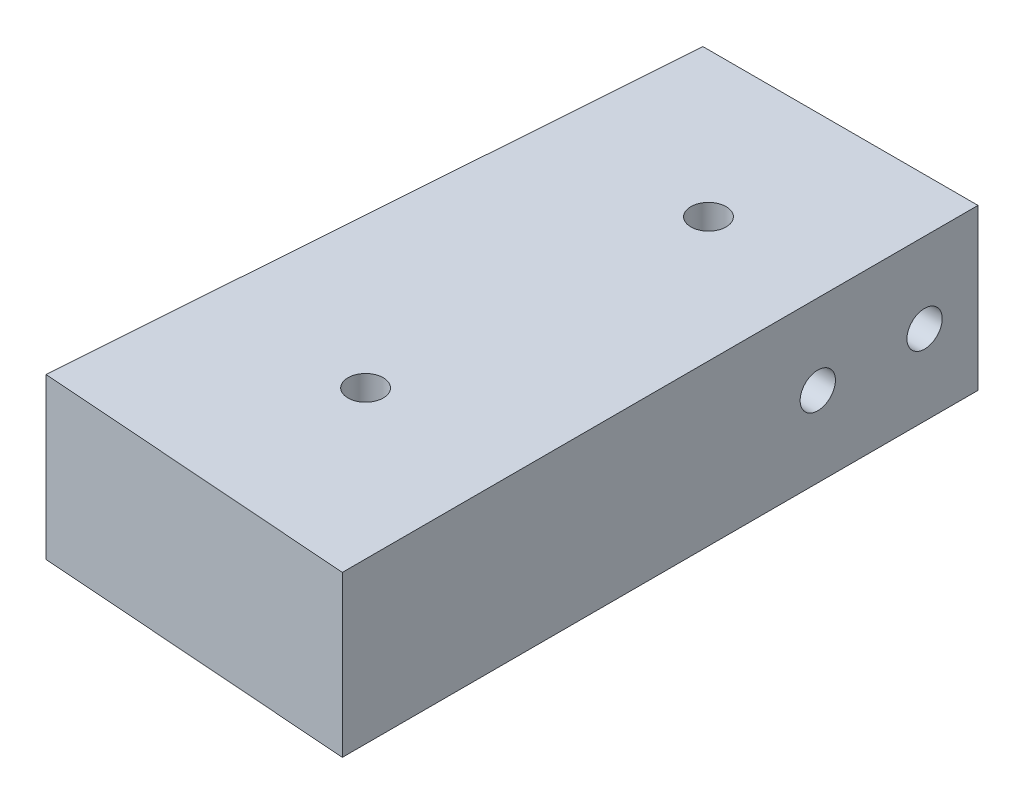
ISO-10303-21;
HEADER;
FILE_DESCRIPTION(('STEP AP214'),'2;1');
FILE_NAME('part.step','',(''),(''),'','','');
FILE_SCHEMA(('AUTOMOTIVE_DESIGN { 1 0 10303 214 1 1 1 1 }'));
ENDSEC;
DATA;
#1=APPLICATION_CONTEXT('core data for automotive mechanical design processes');
#2=APPLICATION_PROTOCOL_DEFINITION('international standard','automotive_design',2000,#1);
#3=PRODUCT_CONTEXT('',#1,'mechanical');
#4=PRODUCT('Part','Part','',(#3));
#5=PRODUCT_RELATED_PRODUCT_CATEGORY('part','',(#4));
#6=PRODUCT_DEFINITION_FORMATION('','',#4);
#7=PRODUCT_DEFINITION_CONTEXT('part definition',#1,'design');
#8=PRODUCT_DEFINITION('design','',#6,#7);
#9=PRODUCT_DEFINITION_SHAPE('','',#8);
#10=(LENGTH_UNIT() NAMED_UNIT(*) SI_UNIT(.MILLI.,.METRE.));
#11=(NAMED_UNIT(*) PLANE_ANGLE_UNIT() SI_UNIT($,.RADIAN.));
#12=(NAMED_UNIT(*) SI_UNIT($,.STERADIAN.) SOLID_ANGLE_UNIT());
#13=UNCERTAINTY_MEASURE_WITH_UNIT(LENGTH_MEASURE(1.E-05),#10,'distance_accuracy_value','');
#14=(GEOMETRIC_REPRESENTATION_CONTEXT(3) GLOBAL_UNCERTAINTY_ASSIGNED_CONTEXT((#13)) GLOBAL_UNIT_ASSIGNED_CONTEXT((#10,
#11,#12)) REPRESENTATION_CONTEXT('',''));
#15=CARTESIAN_POINT('',(0.,0.,0.));
#16=DIRECTION('',(0.,0.,1.));
#17=DIRECTION('',(1.,0.,0.));
#18=AXIS2_PLACEMENT_3D('',#15,#16,#17);
#19=CARTESIAN_POINT('',(680.,15.,0.));
#20=DIRECTION('',(0.,0.,1.));
#21=DIRECTION('',(1.,0.,0.));
#22=AXIS2_PLACEMENT_3D('',#19,#20,#21);
#23=PLANE('',#22);
#24=DIRECTION('',(-1.,0.,0.));
#25=VECTOR('',#24,1.);
#26=CARTESIAN_POINT('',(680.,0.,0.));
#27=LINE('',#26,#25);
#28=CARTESIAN_POINT('',(680.,0.,0.));
#29=VERTEX_POINT('',#28);
#30=CARTESIAN_POINT('',(654.253441161619,0.,0.));
#31=VERTEX_POINT('',#30);
#32=EDGE_CURVE('E111',#29,#31,#27,.T.);
#33=ORIENTED_EDGE('',*,*,#32,.T.);
#34=DIRECTION('',(0.,-1.,0.));
#35=VECTOR('',#34,1.);
#36=CARTESIAN_POINT('',(654.253441161619,15.,0.));
#37=LINE('',#36,#35);
#38=CARTESIAN_POINT('',(654.253441161619,15.,0.));
#39=VERTEX_POINT('',#38);
#40=EDGE_CURVE('E11',#39,#31,#37,.T.);
#41=ORIENTED_EDGE('',*,*,#40,.F.);
#42=DIRECTION('',(-1.,0.,0.));
#43=VECTOR('',#42,1.);
#44=CARTESIAN_POINT('',(680.,15.,0.));
#45=LINE('',#44,#43);
#46=CARTESIAN_POINT('',(680.,15.,0.));
#47=VERTEX_POINT('',#46);
#48=EDGE_CURVE('E98',#47,#39,#45,.T.);
#49=ORIENTED_EDGE('',*,*,#48,.F.);
#50=DIRECTION('',(0.,-1.,0.));
#51=VECTOR('',#50,1.);
#52=CARTESIAN_POINT('',(680.,15.,0.));
#53=LINE('',#52,#51);
#54=EDGE_CURVE('E107',#47,#29,#53,.T.);
#55=ORIENTED_EDGE('',*,*,#54,.T.);
#56=EDGE_LOOP('',(#33,#41,#49,#55));
#57=FACE_BOUND('',#56,.T.);
#58=ADVANCED_FACE('F41',(#57),#23,.F.);
#59=CARTESIAN_POINT('',(654.253441161619,15.,0.));
#60=DIRECTION('',(0.997359929598123,0.,0.0726166016281953));
#61=DIRECTION('',(0.0726166016281953,0.,-0.997359929598123));
#62=AXIS2_PLACEMENT_3D('',#59,#60,#61);
#63=PLANE('',#62);
#64=CARTESIAN_POINT('',(653.161308830955,7.50000000000047,15.));
#65=DIRECTION('',(0.997359929598123,0.,0.0726166016281953));
#66=DIRECTION('',(0.0726166016281953,0.,-0.997359929598123));
#67=AXIS2_PLACEMENT_3D('',#64,#65,#66);
#68=ELLIPSE('',#67,1.65436764705882,1.65);
#69=CARTESIAN_POINT('',(653.281443387328,7.50000000000047,13.35));
#70=VERTEX_POINT('',#69);
#71=EDGE_CURVE('E139',#70,#70,#68,.T.);
#72=ORIENTED_EDGE('',*,*,#71,.T.);
#73=EDGE_LOOP('',(#72));
#74=FACE_BOUND('',#73,.T.);
#75=CARTESIAN_POINT('',(653.889397051398,7.50000000000047,5.));
#76=DIRECTION('',(0.997359929598123,0.,0.0726166016281953));
#77=DIRECTION('',(0.0726166016281953,0.,-0.997359929598123));
#78=AXIS2_PLACEMENT_3D('',#75,#76,#77);
#79=ELLIPSE('',#78,1.65436764705882,1.65);
#80=CARTESIAN_POINT('',(654.009531607771,7.50000000000047,3.35));
#81=VERTEX_POINT('',#80);
#82=EDGE_CURVE('E129',#81,#81,#79,.T.);
#83=ORIENTED_EDGE('',*,*,#82,.T.);
#84=EDGE_LOOP('',(#83));
#85=FACE_BOUND('',#84,.T.);
#86=DIRECTION('',(-0.0726166016281953,0.,0.997359929598123));
#87=VECTOR('',#86,1.);
#88=CARTESIAN_POINT('',(654.253441161619,0.,0.));
#89=LINE('',#88,#87);
#90=CARTESIAN_POINT('',(650.079202112056,0.,57.3315009412578));
#91=VERTEX_POINT('',#90);
#92=EDGE_CURVE('E102',#31,#91,#89,.T.);
#93=ORIENTED_EDGE('',*,*,#92,.T.);
#94=DIRECTION('',(0.,-1.,0.));
#95=VECTOR('',#94,1.);
#96=CARTESIAN_POINT('',(650.079202112056,15.,57.3315009412578));
#97=LINE('',#96,#95);
#98=CARTESIAN_POINT('',(650.079202112056,15.,57.3315009412578));
#99=VERTEX_POINT('',#98);
#100=EDGE_CURVE('E55',#99,#91,#97,.T.);
#101=ORIENTED_EDGE('',*,*,#100,.F.);
#102=DIRECTION('',(-0.0726166016281953,0.,0.997359929598123));
#103=VECTOR('',#102,1.);
#104=CARTESIAN_POINT('',(654.253441161619,15.,0.));
#105=LINE('',#104,#103);
#106=EDGE_CURVE('E93',#39,#99,#105,.T.);
#107=ORIENTED_EDGE('',*,*,#106,.F.);
#108=ORIENTED_EDGE('',*,*,#40,.T.);
#109=EDGE_LOOP('',(#93,#101,#107,#108));
#110=FACE_BOUND('',#109,.T.);
#111=ADVANCED_FACE('F101',(#74,#85,#110),#63,.F.);
#112=CARTESIAN_POINT('',(650.079202112056,15.,57.3315009412578));
#113=DIRECTION('',(0.0726166016281349,0.,-0.997359929598127));
#114=DIRECTION('',(-0.997359929598127,0.,-0.0726166016281349));
#115=AXIS2_PLACEMENT_3D('',#112,#113,#114);
#116=PLANE('',#115);
#117=DIRECTION('',(0.997359929598127,0.,0.0726166016281349));
#118=VECTOR('',#117,1.);
#119=CARTESIAN_POINT('',(650.079202112056,0.,57.3315009412578));
#120=LINE('',#119,#118);
#121=CARTESIAN_POINT('',(680.,0.,59.5099989901018));
#122=VERTEX_POINT('',#121);
#123=EDGE_CURVE('E80',#91,#122,#120,.T.);
#124=ORIENTED_EDGE('',*,*,#123,.T.);
#125=DIRECTION('',(0.,-1.,0.));
#126=VECTOR('',#125,1.);
#127=CARTESIAN_POINT('',(680.,15.,59.5099989901018));
#128=LINE('',#127,#126);
#129=CARTESIAN_POINT('',(680.,15.,59.5099989901018));
#130=VERTEX_POINT('',#129);
#131=EDGE_CURVE('E103',#130,#122,#128,.T.);
#132=ORIENTED_EDGE('',*,*,#131,.F.);
#133=DIRECTION('',(0.997359929598127,0.,0.0726166016281349));
#134=VECTOR('',#133,1.);
#135=CARTESIAN_POINT('',(650.079202112056,15.,57.3315009412578));
#136=LINE('',#135,#134);
#137=EDGE_CURVE('E96',#99,#130,#136,.T.);
#138=ORIENTED_EDGE('',*,*,#137,.F.);
#139=ORIENTED_EDGE('',*,*,#100,.T.);
#140=EDGE_LOOP('',(#124,#132,#138,#139));
#141=FACE_BOUND('',#140,.T.);
#142=ADVANCED_FACE('F105',(#141),#116,.F.);
#143=CARTESIAN_POINT('',(680.,15.,59.5099989901018));
#144=DIRECTION('',(-1.,0.,0.));
#145=DIRECTION('',(0.,0.,1.));
#146=AXIS2_PLACEMENT_3D('',#143,#144,#145);
#147=PLANE('',#146);
#148=CARTESIAN_POINT('',(680.,7.50000000000047,15.));
#149=DIRECTION('',(1.,0.,0.));
#150=DIRECTION('',(0.,0.,-1.));
#151=AXIS2_PLACEMENT_3D('',#148,#149,#150);
#152=CIRCLE('',#151,1.65);
#153=CARTESIAN_POINT('',(680.,7.50000000000047,13.35));
#154=VERTEX_POINT('',#153);
#155=EDGE_CURVE('E145',#154,#154,#152,.T.);
#156=ORIENTED_EDGE('',*,*,#155,.F.);
#157=EDGE_LOOP('',(#156));
#158=FACE_BOUND('',#157,.T.);
#159=CARTESIAN_POINT('',(680.,7.50000000000047,5.));
#160=DIRECTION('',(1.,0.,0.));
#161=DIRECTION('',(0.,0.,-1.));
#162=AXIS2_PLACEMENT_3D('',#159,#160,#161);
#163=CIRCLE('',#162,1.65);
#164=CARTESIAN_POINT('',(680.,7.50000000000047,3.35));
#165=VERTEX_POINT('',#164);
#166=EDGE_CURVE('E142',#165,#165,#163,.T.);
#167=ORIENTED_EDGE('',*,*,#166,.F.);
#168=EDGE_LOOP('',(#167));
#169=FACE_BOUND('',#168,.T.);
#170=DIRECTION('',(0.,0.,-1.));
#171=VECTOR('',#170,1.);
#172=CARTESIAN_POINT('',(680.,0.,59.5099989901018));
#173=LINE('',#172,#171);
#174=EDGE_CURVE('E86',#122,#29,#173,.T.);
#175=ORIENTED_EDGE('',*,*,#174,.T.);
#176=ORIENTED_EDGE('',*,*,#54,.F.);
#177=DIRECTION('',(0.,0.,-1.));
#178=VECTOR('',#177,1.);
#179=CARTESIAN_POINT('',(680.,15.,59.5099989901018));
#180=LINE('',#179,#178);
#181=EDGE_CURVE('E63',#130,#47,#180,.T.);
#182=ORIENTED_EDGE('',*,*,#181,.F.);
#183=ORIENTED_EDGE('',*,*,#131,.T.);
#184=EDGE_LOOP('',(#175,#176,#182,#183));
#185=FACE_BOUND('',#184,.T.);
#186=ADVANCED_FACE('F119',(#158,#169,#185),#147,.F.);
#187=CARTESIAN_POINT('',(0.,15.,0.));
#188=DIRECTION('',(0.,-1.,0.));
#189=DIRECTION('',(0.,0.,-1.));
#190=AXIS2_PLACEMENT_3D('',#187,#188,#189);
#191=PLANE('',#190);
#192=CARTESIAN_POINT('',(668.307348129297,15.,13.5395531337617));
#193=DIRECTION('',(0.,1.,0.));
#194=DIRECTION('',(0.,0.,1.));
#195=AXIS2_PLACEMENT_3D('',#192,#193,#194);
#196=CIRCLE('',#195,1.65000000000005);
#197=CARTESIAN_POINT('',(668.307348129297,15.,15.1895531337618));
#198=VERTEX_POINT('',#197);
#199=EDGE_CURVE('E132',#198,#198,#196,.T.);
#200=ORIENTED_EDGE('',*,*,#199,.F.);
#201=EDGE_LOOP('',(#200));
#202=FACE_BOUND('',#201,.T.);
#203=CARTESIAN_POINT('',(666.128850080451,15.,43.4603510217054));
#204=DIRECTION('',(0.,1.,0.));
#205=DIRECTION('',(0.,0.,1.));
#206=AXIS2_PLACEMENT_3D('',#203,#204,#205);
#207=CIRCLE('',#206,1.65000000000005);
#208=CARTESIAN_POINT('',(666.128850080451,15.,45.1103510217055));
#209=VERTEX_POINT('',#208);
#210=EDGE_CURVE('E128',#209,#209,#207,.T.);
#211=ORIENTED_EDGE('',*,*,#210,.F.);
#212=EDGE_LOOP('',(#211));
#213=FACE_BOUND('',#212,.T.);
#214=ORIENTED_EDGE('',*,*,#48,.T.);
#215=ORIENTED_EDGE('',*,*,#106,.T.);
#216=ORIENTED_EDGE('',*,*,#137,.T.);
#217=ORIENTED_EDGE('',*,*,#181,.T.);
#218=EDGE_LOOP('',(#214,#215,#216,#217));
#219=FACE_BOUND('',#218,.T.);
#220=ADVANCED_FACE('F94',(#202,#213,#219),#191,.F.);
#221=CARTESIAN_POINT('',(0.,0.,0.));
#222=DIRECTION('',(0.,-1.,0.));
#223=DIRECTION('',(0.,0.,-1.));
#224=AXIS2_PLACEMENT_3D('',#221,#222,#223);
#225=PLANE('',#224);
#226=CARTESIAN_POINT('',(668.307348129297,0.,13.5395531337617));
#227=DIRECTION('',(0.,1.,0.));
#228=DIRECTION('',(0.,0.,1.));
#229=AXIS2_PLACEMENT_3D('',#226,#227,#228);
#230=CIRCLE('',#229,1.65000000000005);
#231=CARTESIAN_POINT('',(668.307348129297,0.,15.1895531337618));
#232=VERTEX_POINT('',#231);
#233=EDGE_CURVE('E114',#232,#232,#230,.T.);
#234=ORIENTED_EDGE('',*,*,#233,.T.);
#235=EDGE_LOOP('',(#234));
#236=FACE_BOUND('',#235,.T.);
#237=CARTESIAN_POINT('',(666.128850080451,0.,43.4603510217054));
#238=DIRECTION('',(0.,1.,0.));
#239=DIRECTION('',(0.,0.,1.));
#240=AXIS2_PLACEMENT_3D('',#237,#238,#239);
#241=CIRCLE('',#240,1.65000000000005);
#242=CARTESIAN_POINT('',(666.128850080451,0.,45.1103510217055));
#243=VERTEX_POINT('',#242);
#244=EDGE_CURVE('E125',#243,#243,#241,.T.);
#245=ORIENTED_EDGE('',*,*,#244,.T.);
#246=EDGE_LOOP('',(#245));
#247=FACE_BOUND('',#246,.T.);
#248=ORIENTED_EDGE('',*,*,#32,.F.);
#249=ORIENTED_EDGE('',*,*,#174,.F.);
#250=ORIENTED_EDGE('',*,*,#123,.F.);
#251=ORIENTED_EDGE('',*,*,#92,.F.);
#252=EDGE_LOOP('',(#248,#249,#250,#251));
#253=FACE_BOUND('',#252,.T.);
#254=ADVANCED_FACE('F122',(#236,#247,#253),#225,.T.);
#255=CARTESIAN_POINT('',(668.307348129297,0.,13.5395531337617));
#256=DIRECTION('',(0.,1.,0.));
#257=DIRECTION('',(0.,0.,1.));
#258=AXIS2_PLACEMENT_3D('',#255,#256,#257);
#259=CYLINDRICAL_SURFACE('',#258,1.65000000000005);
#260=CARTESIAN_POINT('',(668.307348129297,5.8609241599366,15.1895531337618));
#261=CARTESIAN_POINT('',(668.399747226542,5.86091764661438,15.1895492101784));
#262=CARTESIAN_POINT('',(668.492276754375,5.85996489547775,15.1817580800193));
#263=CARTESIAN_POINT('',(668.674853657749,5.85683261649108,15.1507797050328));
#264=CARTESIAN_POINT('',(668.764894453461,5.85465011244027,15.1275550841114));
#265=CARTESIAN_POINT('',(668.939809624515,5.85105082015213,15.0663357607546));
#266=CARTESIAN_POINT('',(669.024686185256,5.84963370598925,15.0283473570417));
#267=CARTESIAN_POINT('',(669.186838371618,5.85053093587943,14.9386888582936));
#268=CARTESIAN_POINT('',(669.264117256017,5.85284367265922,14.8870246644697));
#269=CARTESIAN_POINT('',(669.407009432613,5.86471601021422,14.7729923043127));
#270=CARTESIAN_POINT('',(669.472849378032,5.87410841151776,14.7108964116558));
#271=CARTESIAN_POINT('',(669.562530992107,5.89603514030355,14.6114777934852));
#272=CARTESIAN_POINT('',(669.590907936487,5.90464836714072,14.5772985246042));
#273=CARTESIAN_POINT('',(669.644443940042,5.92484450901759,14.5073411215113));
#274=CARTESIAN_POINT('',(669.669603652798,5.936426819446,14.4715633140422));
#275=CARTESIAN_POINT('',(669.733433807648,5.97241799353401,14.3727915506338));
#276=CARTESIAN_POINT('',(669.768782333327,6.00005654433805,14.3087565079686));
#277=CARTESIAN_POINT('',(669.829122295231,6.06570830557103,14.1811891603601));
#278=CARTESIAN_POINT('',(669.854115925868,6.10371931503109,14.1176567517006));
#279=CARTESIAN_POINT('',(669.892945714185,6.185868046245,13.999870148957));
#280=CARTESIAN_POINT('',(669.907567269903,6.22917776059027,13.9452906607304));
#281=CARTESIAN_POINT('',(669.930380709386,6.32313428733789,13.8413806940099));
#282=CARTESIAN_POINT('',(669.938570754621,6.37378319284728,13.7920517199259));
#283=CARTESIAN_POINT('',(669.950659340416,6.48579034402281,13.6962537166267));
#284=CARTESIAN_POINT('',(669.954142355624,6.5476897152337,13.6503675869106));
#285=CARTESIAN_POINT('',(669.957629629536,6.67735118495797,13.5676330949683));
#286=CARTESIAN_POINT('',(669.957631787711,6.74511679880081,13.530790203304));
#287=CARTESIAN_POINT('',(669.955948648797,6.89508242743135,13.4623742402532));
#288=CARTESIAN_POINT('',(669.95402339019,6.97796484602692,13.432295174597));
#289=CARTESIAN_POINT('',(669.950326892514,7.14746273215178,13.3857049698347));
#290=CARTESIAN_POINT('',(669.948555680266,7.2340788458524,13.36919618927));
#291=CARTESIAN_POINT('',(669.946417791439,7.41364895665387,13.3496566522874));
#292=CARTESIAN_POINT('',(669.946133072009,7.50669080671574,13.3474109083517));
#293=CARTESIAN_POINT('',(669.947400487159,7.69182371951429,13.3585654147575));
#294=CARTESIAN_POINT('',(669.948952890916,7.78391464092532,13.3719679579001));
#295=CARTESIAN_POINT('',(669.952691973613,7.96413100697086,13.413933745494));
#296=CARTESIAN_POINT('',(669.954875851651,8.05227201952516,13.4424304941205));
#297=CARTESIAN_POINT('',(669.957531407528,8.22263015876543,13.5137849479316));
#298=CARTESIAN_POINT('',(669.958002332563,8.30484466532616,13.5566489581822));
#299=CARTESIAN_POINT('',(669.954011106757,8.46090353659364,13.655496438768));
#300=CARTESIAN_POINT('',(669.949549095533,8.53474813812586,13.7114795377626));
#301=CARTESIAN_POINT('',(669.931967928631,8.67145187194792,13.8344052216681));
#302=CARTESIAN_POINT('',(669.918861829494,8.73432739174858,13.9013311633761));
#303=CARTESIAN_POINT('',(669.882592217883,8.84072485031947,14.0348860866642));
#304=CARTESIAN_POINT('',(669.860668550039,8.88560394239311,14.1007656647583));
#305=CARTESIAN_POINT('',(669.80554596902,8.96379196555401,14.2346193714432));
#306=CARTESIAN_POINT('',(669.772356616588,8.99711065917044,14.3025916796853));
#307=CARTESIAN_POINT('',(669.699489081317,9.04890516739896,14.4278147147724));
#308=CARTESIAN_POINT('',(669.66119292264,9.06873820002687,14.4853207088469));
#309=CARTESIAN_POINT('',(669.57647255787,9.10089347983972,14.5962921032623));
#310=CARTESIAN_POINT('',(669.530046092668,9.11321363519986,14.6497563746318));
#311=CARTESIAN_POINT('',(669.428497671659,9.13217394691148,14.7523618175865));
#312=CARTESIAN_POINT('',(669.373143243003,9.13861773489861,14.8013075131788));
#313=CARTESIAN_POINT('',(669.256171966648,9.14705087913908,14.8914763339976));
#314=CARTESIAN_POINT('',(669.194552061299,9.14903804948175,14.9326956604654));
#315=CARTESIAN_POINT('',(669.057192951995,9.15049876568889,15.0117519555513));
#316=CARTESIAN_POINT('',(668.980691853621,9.1495748153056,15.0482750688864));
#317=CARTESIAN_POINT('',(668.823012364659,9.14666644312492,15.1091846673746));
#318=CARTESIAN_POINT('',(668.74183205193,9.14468158271395,15.1335661247259));
#319=CARTESIAN_POINT('',(668.569140521719,9.14121048933387,15.1712582047187));
#320=CARTESIAN_POINT('',(668.477361097973,9.1397860006508,15.1833606949447));
#321=CARTESIAN_POINT('',(668.293066444259,9.13878877909786,15.1920689437402));
#322=CARTESIAN_POINT('',(668.200551219142,9.13921603403332,15.1886748043629));
#323=CARTESIAN_POINT('',(668.01735070987,9.14161595338465,15.1664891952429));
#324=CARTESIAN_POINT('',(667.926666623332,9.14358959761607,15.1476879629873));
#325=CARTESIAN_POINT('',(667.749664127367,9.14746021131476,15.0951929768053));
#326=CARTESIAN_POINT('',(667.663348005329,9.14935714050603,15.0614915081377));
#327=CARTESIAN_POINT('',(667.497024030764,9.15038367363059,14.9798675060836));
#328=CARTESIAN_POINT('',(667.417057205728,9.14949657854463,14.9318607269585));
#329=CARTESIAN_POINT('',(667.266545596328,9.14140270952108,14.8232272473808));
#330=CARTESIAN_POINT('',(667.195993567362,9.13420082744327,14.7626103433));
#331=CARTESIAN_POINT('',(667.071112453707,9.11049168118176,14.6357323479002));
#332=CARTESIAN_POINT('',(667.016019340679,9.09463089247137,14.5701090830601));
#333=CARTESIAN_POINT('',(666.91811401101,9.0514232023654,14.4337264056143));
#334=CARTESIAN_POINT('',(666.875283191005,9.02409385715127,14.3629749796247));
#335=CARTESIAN_POINT('',(666.807883272922,8.96163156268128,14.2314737853519));
#336=CARTESIAN_POINT('',(666.781553022688,8.92824250008085,14.1707868743024));
#337=CARTESIAN_POINT('',(666.737668338888,8.852325762199,14.0520130420527));
#338=CARTESIAN_POINT('',(666.720115601136,8.8097963232674,13.9939266252391));
#339=CARTESIAN_POINT('',(666.692811319779,8.71771176515774,13.8843509535998));
#340=CARTESIAN_POINT('',(666.682867979899,8.6683691787117,13.8327290082788));
#341=CARTESIAN_POINT('',(666.668353805078,8.56298487670152,13.736004020791));
#342=CARTESIAN_POINT('',(666.663784880026,8.50694078743353,13.6909033010436));
#343=CARTESIAN_POINT('',(666.657919011266,8.38204484629475,13.6032119578168));
#344=CARTESIAN_POINT('',(666.657097806326,8.31246650680836,13.5616253128944));
#345=CARTESIAN_POINT('',(666.657720621023,8.16797035889654,13.4890855018666));
#346=CARTESIAN_POINT('',(666.659165969002,8.09304944395673,13.4581385842644));
#347=CARTESIAN_POINT('',(666.662638889547,7.93006832963548,13.4044538729502));
#348=CARTESIAN_POINT('',(666.664716047454,7.84152175890064,13.3831827827905));
#349=CARTESIAN_POINT('',(666.667588381528,7.66212428461923,13.3554769002863));
#350=CARTESIAN_POINT('',(666.668383571407,7.57127340573159,13.3490419492445));
#351=CARTESIAN_POINT('',(666.668131942508,7.38796328139805,13.3512093624343));
#352=CARTESIAN_POINT('',(666.667048709281,7.29550741907935,13.3601089757953));
#353=CARTESIAN_POINT('',(666.663763071721,7.11338563550538,13.3932631454281));
#354=CARTESIAN_POINT('',(666.661560240756,7.02372079162397,13.4175235559283));
#355=CARTESIAN_POINT('',(666.658093257681,6.84959474788451,13.4807701185214));
#356=CARTESIAN_POINT('',(666.656830181687,6.76513961481665,13.519773075548));
#357=CARTESIAN_POINT('',(666.658276778389,6.60396943484146,13.6113953316248));
#358=CARTESIAN_POINT('',(666.660986304972,6.52725410337803,13.6640141298309));
#359=CARTESIAN_POINT('',(666.673897752533,6.38595702065298,13.779558621972));
#360=CARTESIAN_POINT('',(666.683896671611,6.32110491686014,13.8421698518627));
#361=CARTESIAN_POINT('',(666.706846398778,6.23296043831565,13.9421253422995));
#362=CARTESIAN_POINT('',(666.715818855634,6.20510604157387,13.9764425594692));
#363=CARTESIAN_POINT('',(666.736757393611,6.15262217791837,14.0465901068451));
#364=CARTESIAN_POINT('',(666.74872286964,6.12799206069082,14.0824201299952));
#365=CARTESIAN_POINT('',(666.78570823354,6.06569508028523,14.1810505072737));
#366=CARTESIAN_POINT('',(666.813941037388,6.03131997498248,14.2447939185804));
#367=CARTESIAN_POINT('',(666.880662574643,5.97277294267669,14.3715367748239));
#368=CARTESIAN_POINT('',(666.919150033631,5.94859974877322,14.434536311192));
#369=CARTESIAN_POINT('',(667.002283702429,5.911034228724,14.5514976484853));
#370=CARTESIAN_POINT('',(667.046165891294,5.89692029518097,14.6057769126392));
#371=CARTESIAN_POINT('',(667.141190552718,5.87501411165591,14.7089548660896));
#372=CARTESIAN_POINT('',(667.19233444012,5.86722309559936,14.7578525035462));
#373=CARTESIAN_POINT('',(667.305542171245,5.85581409188365,14.8528765068528));
#374=CARTESIAN_POINT('',(667.368171271088,5.8526247049921,14.898378200858));
#375=CARTESIAN_POINT('',(667.499276498911,5.84960935302388,14.9802142229346));
#376=CARTESIAN_POINT('',(667.567758679124,5.84978691238517,15.0165389044363));
#377=CARTESIAN_POINT('',(667.719167213651,5.85173206139765,15.0836840926767));
#378=CARTESIAN_POINT('',(667.80276374883,5.85372186032684,15.1129905014267));
#379=CARTESIAN_POINT('',(667.973461440615,5.85740865959582,15.1578184978502));
#380=CARTESIAN_POINT('',(668.060555715878,5.85910620315442,15.1733658873522));
#381=CARTESIAN_POINT('',(668.174676569811,5.86033870917866,15.1844260079135));
#382=CARTESIAN_POINT('',(668.201171728311,5.86055601543833,15.1863474724257));
#383=CARTESIAN_POINT('',(668.254223707169,5.86084967617613,15.1889115900617));
#384=CARTESIAN_POINT('',(668.28078052662,5.8609260327185,15.1895542619136));
#385=CARTESIAN_POINT('',(668.307348129297,5.8609241599366,15.1895531337618));
#386=B_SPLINE_CURVE_WITH_KNOTS('',3,(#260,#261,#262,#263,#264,#265,#266,#267,#268,#269,#270,
#271,#272,#273,#274,#275,#276,#277,#278,#279,#280,#281,#282,#283,#284,#285,#286,#287,#288,#289,
#290,#291,#292,#293,#294,#295,#296,#297,#298,#299,#300,#301,#302,#303,#304,#305,#306,#307,#308,
#309,#310,#311,#312,#313,#314,#315,#316,#317,#318,#319,#320,#321,#322,#323,#324,#325,#326,#327,
#328,#329,#330,#331,#332,#333,#334,#335,#336,#337,#338,#339,#340,#341,#342,#343,#344,#345,#346,
#347,#348,#349,#350,#351,#352,#353,#354,#355,#356,#357,#358,#359,#360,#361,#362,#363,#364,#365,
#366,#367,#368,#369,#370,#371,#372,#373,#374,#375,#376,#377,#378,#379,#380,#381,#382,#383,#384,
#385),.UNSPECIFIED.,.T.,.F.,(4,2,2,2,2,2,2,2,2,2,2,2,2,2,2,2,2,2,2,2,2,2,2,2,2,2,2,2,2,2,2,2,2,
2,2,2,2,2,2,2,2,2,2,2,2,2,2,2,2,2,2,2,2,2,2,2,2,2,2,2,2,2,4),(0.,0.277096228363374,
0.554865972710162,0.832517341076109,1.11004909544078,1.38122410953454,1.51676754731924,
1.65228340552208,1.88541150570274,2.11849017601844,2.33115808152582,2.54388675885368,
2.7743813506104,3.00501503462477,3.26843960086459,3.53190994112042,3.80976398684098,
4.08765874909533,4.36433933654974,4.64114150447152,4.91793583835253,5.19431304025649,
5.4408248980727,5.687128071879,5.90177835937525,6.11648838510595,6.33813523229856,
6.55989077051809,6.81317105741418,7.06655613943444,7.34297938718908,7.61940081455863,
7.89599752848402,8.17273762104407,8.45114081019296,8.72932851981422,8.98913010521258,
9.24853542622153,9.4697067369777,9.69092076146538,9.90635653049706,10.1218688351992,
10.3640929863903,10.6064591490471,10.8784643229404,11.1504665872713,11.4278009089732,
11.7052409905849,11.982998282775,12.2607453594118,12.5310393725716,12.6661305177526,
12.8011943739093,13.0329596414719,13.264696119334,13.477426235073,13.6901978553915,
13.9217333044308,14.153511132549,14.418202207702,14.6823958582546,14.7620707742933,
14.8417445234733),.UNSPECIFIED.);
#387=CARTESIAN_POINT('',(668.307348129297,5.8609241599366,15.1895531337618));
#388=VERTEX_POINT('',#387);
#389=EDGE_CURVE('E44',#388,#388,#386,.T.);
#390=ORIENTED_EDGE('',*,*,#389,.T.);
#391=EDGE_LOOP('',(#390));
#392=FACE_BOUND('',#391,.T.);
#393=ORIENTED_EDGE('',*,*,#199,.T.);
#394=EDGE_LOOP('',(#393));
#395=FACE_BOUND('',#394,.T.);
#396=ORIENTED_EDGE('',*,*,#233,.F.);
#397=EDGE_LOOP('',(#396));
#398=FACE_BOUND('',#397,.T.);
#399=ADVANCED_FACE('F152',(#392,#395,#398),#259,.F.);
#400=CARTESIAN_POINT('',(666.128850080451,0.,43.4603510217054));
#401=DIRECTION('',(0.,1.,0.));
#402=DIRECTION('',(0.,0.,1.));
#403=AXIS2_PLACEMENT_3D('',#400,#401,#402);
#404=CYLINDRICAL_SURFACE('',#403,1.65000000000005);
#405=ORIENTED_EDGE('',*,*,#244,.F.);
#406=EDGE_LOOP('',(#405));
#407=FACE_BOUND('',#406,.T.);
#408=ORIENTED_EDGE('',*,*,#210,.T.);
#409=EDGE_LOOP('',(#408));
#410=FACE_BOUND('',#409,.T.);
#411=ADVANCED_FACE('F158',(#407,#410),#404,.F.);
#412=CARTESIAN_POINT('',(650.079202112056,7.50000000000047,15.));
#413=DIRECTION('',(1.,0.,0.));
#414=DIRECTION('',(0.,0.,-1.));
#415=AXIS2_PLACEMENT_3D('',#412,#413,#414);
#416=CYLINDRICAL_SURFACE('',#415,1.65);
#417=ORIENTED_EDGE('',*,*,#389,.F.);
#418=EDGE_LOOP('',(#417));
#419=FACE_BOUND('',#418,.T.);
#420=ORIENTED_EDGE('',*,*,#155,.T.);
#421=EDGE_LOOP('',(#420));
#422=FACE_BOUND('',#421,.T.);
#423=ORIENTED_EDGE('',*,*,#71,.F.);
#424=EDGE_LOOP('',(#423));
#425=FACE_BOUND('',#424,.T.);
#426=ADVANCED_FACE('F155',(#419,#422,#425),#416,.F.);
#427=CARTESIAN_POINT('',(650.079202112056,7.50000000000047,5.));
#428=DIRECTION('',(1.,0.,0.));
#429=DIRECTION('',(0.,0.,-1.));
#430=AXIS2_PLACEMENT_3D('',#427,#428,#429);
#431=CYLINDRICAL_SURFACE('',#430,1.65);
#432=ORIENTED_EDGE('',*,*,#166,.T.);
#433=EDGE_LOOP('',(#432));
#434=FACE_BOUND('',#433,.T.);
#435=ORIENTED_EDGE('',*,*,#82,.F.);
#436=EDGE_LOOP('',(#435));
#437=FACE_BOUND('',#436,.T.);
#438=ADVANCED_FACE('F157',(#434,#437),#431,.F.);
#439=CLOSED_SHELL('',(#58,#111,#142,#186,#220,#254,#399,#411,#426,#438));
#440=MANIFOLD_SOLID_BREP('B2',#439);
#441=ADVANCED_BREP_SHAPE_REPRESENTATION('',(#18,#440),#14);
#442=SHAPE_DEFINITION_REPRESENTATION(#9,#441);
ENDSEC;
END-ISO-10303-21;
